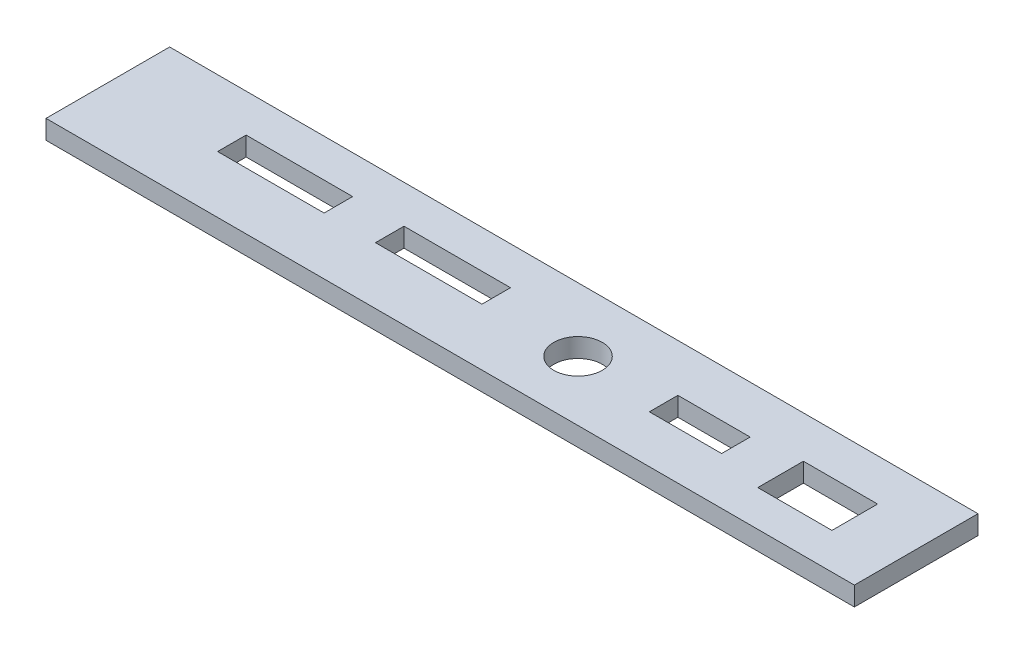
ISO-10303-21;
HEADER;
FILE_DESCRIPTION(('STEP AP214'),'2;1');
FILE_NAME('part.step','',(''),(''),'','','');
FILE_SCHEMA(('AUTOMOTIVE_DESIGN { 1 0 10303 214 1 1 1 1 }'));
ENDSEC;
DATA;
#1=APPLICATION_CONTEXT('core data for automotive mechanical design processes');
#2=APPLICATION_PROTOCOL_DEFINITION('international standard','automotive_design',2000,#1);
#3=PRODUCT_CONTEXT('',#1,'mechanical');
#4=PRODUCT('Part','Part','',(#3));
#5=PRODUCT_RELATED_PRODUCT_CATEGORY('part','',(#4));
#6=PRODUCT_DEFINITION_FORMATION('','',#4);
#7=PRODUCT_DEFINITION_CONTEXT('part definition',#1,'design');
#8=PRODUCT_DEFINITION('design','',#6,#7);
#9=PRODUCT_DEFINITION_SHAPE('','',#8);
#10=(LENGTH_UNIT() NAMED_UNIT(*) SI_UNIT(.MILLI.,.METRE.));
#11=(NAMED_UNIT(*) PLANE_ANGLE_UNIT() SI_UNIT($,.RADIAN.));
#12=(NAMED_UNIT(*) SI_UNIT($,.STERADIAN.) SOLID_ANGLE_UNIT());
#13=UNCERTAINTY_MEASURE_WITH_UNIT(LENGTH_MEASURE(1.E-05),#10,'distance_accuracy_value','');
#14=(GEOMETRIC_REPRESENTATION_CONTEXT(3) GLOBAL_UNCERTAINTY_ASSIGNED_CONTEXT((#13)) GLOBAL_UNIT_ASSIGNED_CONTEXT((#10,
#11,#12)) REPRESENTATION_CONTEXT('',''));
#15=CARTESIAN_POINT('',(0.,0.,0.));
#16=DIRECTION('',(0.,0.,1.));
#17=DIRECTION('',(1.,0.,0.));
#18=AXIS2_PLACEMENT_3D('',#15,#16,#17);
#19=CARTESIAN_POINT('',(0.,2.,0.));
#20=DIRECTION('',(0.,1.,0.));
#21=DIRECTION('',(0.,0.,1.));
#22=AXIS2_PLACEMENT_3D('',#19,#20,#21);
#23=PLANE('',#22);
#24=DIRECTION('',(-1.,0.,0.));
#25=VECTOR('',#24,1.);
#26=CARTESIAN_POINT('',(29.7913481709879,2.,-0.831151968342935));
#27=LINE('',#26,#25);
#28=CARTESIAN_POINT('',(29.7913481709879,2.,-0.831151968342935));
#29=VERTEX_POINT('',#28);
#30=CARTESIAN_POINT('',(18.5913481709879,2.,-0.831151968342933));
#31=VERTEX_POINT('',#30);
#32=EDGE_CURVE('E216',#29,#31,#27,.T.);
#33=ORIENTED_EDGE('',*,*,#32,.F.);
#34=DIRECTION('',(0.,0.,-1.));
#35=VECTOR('',#34,1.);
#36=CARTESIAN_POINT('',(29.7913481709879,2.,2.16884803165706));
#37=LINE('',#36,#35);
#38=CARTESIAN_POINT('',(29.7913481709879,2.,2.16884803165706));
#39=VERTEX_POINT('',#38);
#40=EDGE_CURVE('E214',#39,#29,#37,.T.);
#41=ORIENTED_EDGE('',*,*,#40,.F.);
#42=DIRECTION('',(1.,0.,0.));
#43=VECTOR('',#42,1.);
#44=CARTESIAN_POINT('',(29.7913481709879,2.,2.16884803165706));
#45=LINE('',#44,#43);
#46=CARTESIAN_POINT('',(18.5913481709879,2.,2.16884803165707));
#47=VERTEX_POINT('',#46);
#48=EDGE_CURVE('E222',#47,#39,#45,.T.);
#49=ORIENTED_EDGE('',*,*,#48,.F.);
#50=DIRECTION('',(0.,0.,1.));
#51=VECTOR('',#50,1.);
#52=CARTESIAN_POINT('',(18.5913481709879,2.,2.16884803165707));
#53=LINE('',#52,#51);
#54=EDGE_CURVE('E219',#31,#47,#53,.T.);
#55=ORIENTED_EDGE('',*,*,#54,.F.);
#56=EDGE_LOOP('',(#33,#41,#49,#55));
#57=FACE_BOUND('',#56,.T.);
#58=DIRECTION('',(-1.,0.,0.));
#59=VECTOR('',#58,1.);
#60=CARTESIAN_POINT('',(55.9913481709879,2.,0.168848031657063));
#61=LINE('',#60,#59);
#62=CARTESIAN_POINT('',(55.9913481709879,2.,0.168848031657063));
#63=VERTEX_POINT('',#62);
#64=CARTESIAN_POINT('',(48.3913481709879,2.,0.168848031657064));
#65=VERTEX_POINT('',#64);
#66=EDGE_CURVE('E247',#63,#65,#61,.T.);
#67=ORIENTED_EDGE('',*,*,#66,.F.);
#68=DIRECTION('',(0.,0.,-1.));
#69=VECTOR('',#68,1.);
#70=CARTESIAN_POINT('',(55.9913481709879,2.,3.16884803165706));
#71=LINE('',#70,#69);
#72=CARTESIAN_POINT('',(55.9913481709879,2.,3.16884803165706));
#73=VERTEX_POINT('',#72);
#74=EDGE_CURVE('E245',#73,#63,#71,.T.);
#75=ORIENTED_EDGE('',*,*,#74,.F.);
#76=DIRECTION('',(1.,0.,0.));
#77=VECTOR('',#76,1.);
#78=CARTESIAN_POINT('',(55.9913481709879,2.,3.16884803165706));
#79=LINE('',#78,#77);
#80=CARTESIAN_POINT('',(48.3913481709879,2.,3.16884803165706));
#81=VERTEX_POINT('',#80);
#82=EDGE_CURVE('E253',#81,#73,#79,.T.);
#83=ORIENTED_EDGE('',*,*,#82,.F.);
#84=DIRECTION('',(0.,0.,1.));
#85=VECTOR('',#84,1.);
#86=CARTESIAN_POINT('',(48.3913481709879,2.,3.16884803165706));
#87=LINE('',#86,#85);
#88=EDGE_CURVE('E250',#65,#81,#87,.T.);
#89=ORIENTED_EDGE('',*,*,#88,.F.);
#90=EDGE_LOOP('',(#67,#75,#83,#89));
#91=FACE_BOUND('',#90,.T.);
#92=DIRECTION('',(-1.,0.,0.));
#93=VECTOR('',#92,1.);
#94=CARTESIAN_POINT('',(68.7913481709879,2.,-0.431151968342938));
#95=LINE('',#94,#93);
#96=CARTESIAN_POINT('',(68.7913481709879,2.,-0.431151968342938));
#97=VERTEX_POINT('',#96);
#98=CARTESIAN_POINT('',(60.9913481709879,2.,-0.431151968342937));
#99=VERTEX_POINT('',#98);
#100=EDGE_CURVE('E278',#97,#99,#95,.T.);
#101=ORIENTED_EDGE('',*,*,#100,.F.);
#102=DIRECTION('',(0.,0.,-1.));
#103=VECTOR('',#102,1.);
#104=CARTESIAN_POINT('',(68.7913481709879,2.,4.36884803165706));
#105=LINE('',#104,#103);
#106=CARTESIAN_POINT('',(68.7913481709879,2.,4.36884803165706));
#107=VERTEX_POINT('',#106);
#108=EDGE_CURVE('E276',#107,#97,#105,.T.);
#109=ORIENTED_EDGE('',*,*,#108,.F.);
#110=DIRECTION('',(1.,0.,0.));
#111=VECTOR('',#110,1.);
#112=CARTESIAN_POINT('',(68.7913481709879,2.,4.36884803165706));
#113=LINE('',#112,#111);
#114=CARTESIAN_POINT('',(60.9913481709879,2.,4.36884803165706));
#115=VERTEX_POINT('',#114);
#116=EDGE_CURVE('E284',#115,#107,#113,.T.);
#117=ORIENTED_EDGE('',*,*,#116,.F.);
#118=DIRECTION('',(0.,0.,1.));
#119=VECTOR('',#118,1.);
#120=CARTESIAN_POINT('',(60.9913481709879,2.,4.36884803165706));
#121=LINE('',#120,#119);
#122=EDGE_CURVE('E281',#99,#115,#121,.T.);
#123=ORIENTED_EDGE('',*,*,#122,.F.);
#124=EDGE_LOOP('',(#101,#109,#117,#123));
#125=FACE_BOUND('',#124,.T.);
#126=DIRECTION('',(0.,0.,1.));
#127=VECTOR('',#126,1.);
#128=CARTESIAN_POINT('',(-10.0513698630137,2.,-4.83115196834293));
#129=LINE('',#128,#127);
#130=CARTESIAN_POINT('',(-10.0513698630137,2.,-4.83115196834293));
#131=VERTEX_POINT('',#130);
#132=CARTESIAN_POINT('',(-10.0513698630137,2.,8.16884803165707));
#133=VERTEX_POINT('',#132);
#134=EDGE_CURVE('E307',#131,#133,#129,.T.);
#135=ORIENTED_EDGE('',*,*,#134,.T.);
#136=DIRECTION('',(1.,0.,0.));
#137=VECTOR('',#136,1.);
#138=CARTESIAN_POINT('',(-10.0513698630137,2.,8.16884803165707));
#139=LINE('',#138,#137);
#140=CARTESIAN_POINT('',(74.9486301369863,2.,8.16884803165706));
#141=VERTEX_POINT('',#140);
#142=EDGE_CURVE('E310',#133,#141,#139,.T.);
#143=ORIENTED_EDGE('',*,*,#142,.T.);
#144=DIRECTION('',(0.,0.,-1.));
#145=VECTOR('',#144,1.);
#146=CARTESIAN_POINT('',(74.9486301369863,2.,-4.83115196834293));
#147=LINE('',#146,#145);
#148=CARTESIAN_POINT('',(74.9486301369863,2.,-4.83115196834293));
#149=VERTEX_POINT('',#148);
#150=EDGE_CURVE('E313',#141,#149,#147,.T.);
#151=ORIENTED_EDGE('',*,*,#150,.T.);
#152=DIRECTION('',(-1.,0.,0.));
#153=VECTOR('',#152,1.);
#154=CARTESIAN_POINT('',(-10.0513698630137,2.,-4.83115196834293));
#155=LINE('',#154,#153);
#156=EDGE_CURVE('E315',#149,#131,#155,.T.);
#157=ORIENTED_EDGE('',*,*,#156,.T.);
#158=EDGE_LOOP('',(#135,#143,#151,#157));
#159=FACE_BOUND('',#158,.T.);
#160=CARTESIAN_POINT('',(39.5913481709879,2.,1.86884803165706));
#161=DIRECTION('',(0.,1.,0.));
#162=DIRECTION('',(0.,0.,1.));
#163=AXIS2_PLACEMENT_3D('',#160,#161,#162);
#164=CIRCLE('',#163,2.55);
#165=CARTESIAN_POINT('',(39.5913481709879,2.,4.41884803165706));
#166=VERTEX_POINT('',#165);
#167=EDGE_CURVE('E208',#166,#166,#164,.T.);
#168=ORIENTED_EDGE('',*,*,#167,.F.);
#169=EDGE_LOOP('',(#168));
#170=FACE_BOUND('',#169,.T.);
#171=DIRECTION('',(1.,0.,0.));
#172=VECTOR('',#171,1.);
#173=CARTESIAN_POINT('',(1.99134817098792,2.,2.16884803165707));
#174=LINE('',#173,#172);
#175=CARTESIAN_POINT('',(1.99134817098792,2.,2.16884803165707));
#176=VERTEX_POINT('',#175);
#177=CARTESIAN_POINT('',(13.1913481709879,2.,2.16884803165707));
#178=VERTEX_POINT('',#177);
#179=EDGE_CURVE('E180',#176,#178,#174,.T.);
#180=ORIENTED_EDGE('',*,*,#179,.F.);
#181=DIRECTION('',(0.,0.,1.));
#182=VECTOR('',#181,1.);
#183=CARTESIAN_POINT('',(1.99134817098792,2.,-0.831151968342934));
#184=LINE('',#183,#182);
#185=CARTESIAN_POINT('',(1.99134817098792,2.,-0.831151968342934));
#186=VERTEX_POINT('',#185);
#187=EDGE_CURVE('E172',#186,#176,#184,.T.);
#188=ORIENTED_EDGE('',*,*,#187,.F.);
#189=DIRECTION('',(-1.,0.,0.));
#190=VECTOR('',#189,1.);
#191=CARTESIAN_POINT('',(1.99134817098792,2.,-0.831151968342934));
#192=LINE('',#191,#190);
#193=CARTESIAN_POINT('',(13.1913481709879,2.,-0.831151968342934));
#194=VERTEX_POINT('',#193);
#195=EDGE_CURVE('E194',#194,#186,#192,.T.);
#196=ORIENTED_EDGE('',*,*,#195,.F.);
#197=DIRECTION('',(0.,0.,-1.));
#198=VECTOR('',#197,1.);
#199=CARTESIAN_POINT('',(13.1913481709879,2.,-0.831151968342934));
#200=LINE('',#199,#198);
#201=EDGE_CURVE('E192',#178,#194,#200,.T.);
#202=ORIENTED_EDGE('',*,*,#201,.F.);
#203=EDGE_LOOP('',(#180,#188,#196,#202));
#204=FACE_BOUND('',#203,.T.);
#205=ADVANCED_FACE('F35',(#57,#91,#125,#159,#170,#204),#23,.T.);
#206=CARTESIAN_POINT('',(0.,0.,0.));
#207=DIRECTION('',(0.,1.,0.));
#208=DIRECTION('',(0.,0.,1.));
#209=AXIS2_PLACEMENT_3D('',#206,#207,#208);
#210=PLANE('',#209);
#211=CARTESIAN_POINT('',(39.5913481709879,0.,1.86884803165706));
#212=DIRECTION('',(0.,1.,0.));
#213=DIRECTION('',(0.,0.,1.));
#214=AXIS2_PLACEMENT_3D('',#211,#212,#213);
#215=CIRCLE('',#214,2.55);
#216=CARTESIAN_POINT('',(39.5913481709879,0.,4.41884803165706));
#217=VERTEX_POINT('',#216);
#218=EDGE_CURVE('E188',#217,#217,#215,.T.);
#219=ORIENTED_EDGE('',*,*,#218,.T.);
#220=EDGE_LOOP('',(#219));
#221=FACE_BOUND('',#220,.T.);
#222=DIRECTION('',(0.,0.,-1.));
#223=VECTOR('',#222,1.);
#224=CARTESIAN_POINT('',(29.7913481709879,0.,2.16884803165706));
#225=LINE('',#224,#223);
#226=CARTESIAN_POINT('',(29.7913481709879,0.,2.16884803165706));
#227=VERTEX_POINT('',#226);
#228=CARTESIAN_POINT('',(29.7913481709879,0.,-0.831151968342935));
#229=VERTEX_POINT('',#228);
#230=EDGE_CURVE('E211',#227,#229,#225,.T.);
#231=ORIENTED_EDGE('',*,*,#230,.T.);
#232=DIRECTION('',(-1.,0.,0.));
#233=VECTOR('',#232,1.);
#234=CARTESIAN_POINT('',(29.7913481709879,0.,-0.831151968342935));
#235=LINE('',#234,#233);
#236=CARTESIAN_POINT('',(18.5913481709879,0.,-0.831151968342933));
#237=VERTEX_POINT('',#236);
#238=EDGE_CURVE('E227',#229,#237,#235,.T.);
#239=ORIENTED_EDGE('',*,*,#238,.T.);
#240=DIRECTION('',(0.,0.,1.));
#241=VECTOR('',#240,1.);
#242=CARTESIAN_POINT('',(18.5913481709879,0.,2.16884803165707));
#243=LINE('',#242,#241);
#244=CARTESIAN_POINT('',(18.5913481709879,0.,2.16884803165707));
#245=VERTEX_POINT('',#244);
#246=EDGE_CURVE('E230',#237,#245,#243,.T.);
#247=ORIENTED_EDGE('',*,*,#246,.T.);
#248=DIRECTION('',(1.,0.,0.));
#249=VECTOR('',#248,1.);
#250=CARTESIAN_POINT('',(29.7913481709879,0.,2.16884803165706));
#251=LINE('',#250,#249);
#252=EDGE_CURVE('E217',#245,#227,#251,.T.);
#253=ORIENTED_EDGE('',*,*,#252,.T.);
#254=EDGE_LOOP('',(#231,#239,#247,#253));
#255=FACE_BOUND('',#254,.T.);
#256=DIRECTION('',(0.,0.,-1.));
#257=VECTOR('',#256,1.);
#258=CARTESIAN_POINT('',(68.7913481709879,0.,4.36884803165706));
#259=LINE('',#258,#257);
#260=CARTESIAN_POINT('',(68.7913481709879,0.,4.36884803165706));
#261=VERTEX_POINT('',#260);
#262=CARTESIAN_POINT('',(68.7913481709879,0.,-0.431151968342938));
#263=VERTEX_POINT('',#262);
#264=EDGE_CURVE('E275',#261,#263,#259,.T.);
#265=ORIENTED_EDGE('',*,*,#264,.T.);
#266=DIRECTION('',(-1.,0.,0.));
#267=VECTOR('',#266,1.);
#268=CARTESIAN_POINT('',(68.7913481709879,0.,-0.431151968342938));
#269=LINE('',#268,#267);
#270=CARTESIAN_POINT('',(60.9913481709879,0.,-0.431151968342937));
#271=VERTEX_POINT('',#270);
#272=EDGE_CURVE('E289',#263,#271,#269,.T.);
#273=ORIENTED_EDGE('',*,*,#272,.T.);
#274=DIRECTION('',(0.,0.,1.));
#275=VECTOR('',#274,1.);
#276=CARTESIAN_POINT('',(60.9913481709879,0.,4.36884803165706));
#277=LINE('',#276,#275);
#278=CARTESIAN_POINT('',(60.9913481709879,0.,4.36884803165706));
#279=VERTEX_POINT('',#278);
#280=EDGE_CURVE('E292',#271,#279,#277,.T.);
#281=ORIENTED_EDGE('',*,*,#280,.T.);
#282=DIRECTION('',(1.,0.,0.));
#283=VECTOR('',#282,1.);
#284=CARTESIAN_POINT('',(68.7913481709879,0.,4.36884803165706));
#285=LINE('',#284,#283);
#286=EDGE_CURVE('E279',#279,#261,#285,.T.);
#287=ORIENTED_EDGE('',*,*,#286,.T.);
#288=EDGE_LOOP('',(#265,#273,#281,#287));
#289=FACE_BOUND('',#288,.T.);
#290=DIRECTION('',(0.,0.,1.));
#291=VECTOR('',#290,1.);
#292=CARTESIAN_POINT('',(-10.0513698630137,0.,-4.83115196834293));
#293=LINE('',#292,#291);
#294=CARTESIAN_POINT('',(-10.0513698630137,0.,-4.83115196834293));
#295=VERTEX_POINT('',#294);
#296=CARTESIAN_POINT('',(-10.0513698630137,0.,8.16884803165707));
#297=VERTEX_POINT('',#296);
#298=EDGE_CURVE('E306',#295,#297,#293,.T.);
#299=ORIENTED_EDGE('',*,*,#298,.F.);
#300=DIRECTION('',(-1.,0.,0.));
#301=VECTOR('',#300,1.);
#302=CARTESIAN_POINT('',(-10.0513698630137,0.,-4.83115196834293));
#303=LINE('',#302,#301);
#304=CARTESIAN_POINT('',(74.9486301369863,0.,-4.83115196834293));
#305=VERTEX_POINT('',#304);
#306=EDGE_CURVE('E311',#305,#295,#303,.T.);
#307=ORIENTED_EDGE('',*,*,#306,.F.);
#308=DIRECTION('',(0.,0.,-1.));
#309=VECTOR('',#308,1.);
#310=CARTESIAN_POINT('',(74.9486301369863,0.,-4.83115196834293));
#311=LINE('',#310,#309);
#312=CARTESIAN_POINT('',(74.9486301369863,0.,8.16884803165706));
#313=VERTEX_POINT('',#312);
#314=EDGE_CURVE('E322',#313,#305,#311,.T.);
#315=ORIENTED_EDGE('',*,*,#314,.F.);
#316=DIRECTION('',(1.,0.,0.));
#317=VECTOR('',#316,1.);
#318=CARTESIAN_POINT('',(-10.0513698630137,0.,8.16884803165707));
#319=LINE('',#318,#317);
#320=EDGE_CURVE('E320',#297,#313,#319,.T.);
#321=ORIENTED_EDGE('',*,*,#320,.F.);
#322=EDGE_LOOP('',(#299,#307,#315,#321));
#323=FACE_BOUND('',#322,.T.);
#324=DIRECTION('',(0.,0.,-1.));
#325=VECTOR('',#324,1.);
#326=CARTESIAN_POINT('',(55.9913481709879,0.,3.16884803165706));
#327=LINE('',#326,#325);
#328=CARTESIAN_POINT('',(55.9913481709879,0.,3.16884803165706));
#329=VERTEX_POINT('',#328);
#330=CARTESIAN_POINT('',(55.9913481709879,0.,0.168848031657063));
#331=VERTEX_POINT('',#330);
#332=EDGE_CURVE('E244',#329,#331,#327,.T.);
#333=ORIENTED_EDGE('',*,*,#332,.T.);
#334=DIRECTION('',(-1.,0.,0.));
#335=VECTOR('',#334,1.);
#336=CARTESIAN_POINT('',(55.9913481709879,0.,0.168848031657063));
#337=LINE('',#336,#335);
#338=CARTESIAN_POINT('',(48.3913481709879,0.,0.168848031657064));
#339=VERTEX_POINT('',#338);
#340=EDGE_CURVE('E258',#331,#339,#337,.T.);
#341=ORIENTED_EDGE('',*,*,#340,.T.);
#342=DIRECTION('',(0.,0.,1.));
#343=VECTOR('',#342,1.);
#344=CARTESIAN_POINT('',(48.3913481709879,0.,3.16884803165706));
#345=LINE('',#344,#343);
#346=CARTESIAN_POINT('',(48.3913481709879,0.,3.16884803165706));
#347=VERTEX_POINT('',#346);
#348=EDGE_CURVE('E261',#339,#347,#345,.T.);
#349=ORIENTED_EDGE('',*,*,#348,.T.);
#350=DIRECTION('',(1.,0.,0.));
#351=VECTOR('',#350,1.);
#352=CARTESIAN_POINT('',(55.9913481709879,0.,3.16884803165706));
#353=LINE('',#352,#351);
#354=EDGE_CURVE('E248',#347,#329,#353,.T.);
#355=ORIENTED_EDGE('',*,*,#354,.T.);
#356=EDGE_LOOP('',(#333,#341,#349,#355));
#357=FACE_BOUND('',#356,.T.);
#358=DIRECTION('',(0.,0.,1.));
#359=VECTOR('',#358,1.);
#360=CARTESIAN_POINT('',(1.99134817098792,0.,-0.831151968342934));
#361=LINE('',#360,#359);
#362=CARTESIAN_POINT('',(1.99134817098792,0.,-0.831151968342934));
#363=VERTEX_POINT('',#362);
#364=CARTESIAN_POINT('',(1.99134817098792,0.,2.16884803165707));
#365=VERTEX_POINT('',#364);
#366=EDGE_CURVE('E58',#363,#365,#361,.T.);
#367=ORIENTED_EDGE('',*,*,#366,.T.);
#368=DIRECTION('',(1.,0.,0.));
#369=VECTOR('',#368,1.);
#370=CARTESIAN_POINT('',(1.99134817098792,0.,2.16884803165707));
#371=LINE('',#370,#369);
#372=CARTESIAN_POINT('',(13.1913481709879,0.,2.16884803165707));
#373=VERTEX_POINT('',#372);
#374=EDGE_CURVE('E187',#365,#373,#371,.T.);
#375=ORIENTED_EDGE('',*,*,#374,.T.);
#376=DIRECTION('',(0.,0.,-1.));
#377=VECTOR('',#376,1.);
#378=CARTESIAN_POINT('',(13.1913481709879,0.,-0.831151968342934));
#379=LINE('',#378,#377);
#380=CARTESIAN_POINT('',(13.1913481709879,0.,-0.831151968342934));
#381=VERTEX_POINT('',#380);
#382=EDGE_CURVE('E200',#373,#381,#379,.T.);
#383=ORIENTED_EDGE('',*,*,#382,.T.);
#384=DIRECTION('',(-1.,0.,0.));
#385=VECTOR('',#384,1.);
#386=CARTESIAN_POINT('',(1.99134817098792,0.,-0.831151968342934));
#387=LINE('',#386,#385);
#388=EDGE_CURVE('E181',#381,#363,#387,.T.);
#389=ORIENTED_EDGE('',*,*,#388,.T.);
#390=EDGE_LOOP('',(#367,#375,#383,#389));
#391=FACE_BOUND('',#390,.T.);
#392=ADVANCED_FACE('F340',(#221,#255,#289,#323,#357,#391),#210,.F.);
#393=CARTESIAN_POINT('',(-10.0513698630137,2.,-4.83115196834293));
#394=DIRECTION('',(1.,0.,0.));
#395=DIRECTION('',(0.,0.,-1.));
#396=AXIS2_PLACEMENT_3D('',#393,#394,#395);
#397=PLANE('',#396);
#398=ORIENTED_EDGE('',*,*,#298,.T.);
#399=DIRECTION('',(0.,-1.,0.));
#400=VECTOR('',#399,1.);
#401=CARTESIAN_POINT('',(-10.0513698630137,2.,8.16884803165707));
#402=LINE('',#401,#400);
#403=EDGE_CURVE('E11',#133,#297,#402,.T.);
#404=ORIENTED_EDGE('',*,*,#403,.F.);
#405=ORIENTED_EDGE('',*,*,#134,.F.);
#406=DIRECTION('',(0.,-1.,0.));
#407=VECTOR('',#406,1.);
#408=CARTESIAN_POINT('',(-10.0513698630137,2.,-4.83115196834293));
#409=LINE('',#408,#407);
#410=EDGE_CURVE('E317',#131,#295,#409,.T.);
#411=ORIENTED_EDGE('',*,*,#410,.T.);
#412=EDGE_LOOP('',(#398,#404,#405,#411));
#413=FACE_BOUND('',#412,.T.);
#414=ADVANCED_FACE('F37',(#413),#397,.F.);
#415=CARTESIAN_POINT('',(-10.0513698630137,2.,8.16884803165707));
#416=DIRECTION('',(0.,0.,-1.));
#417=DIRECTION('',(-1.,0.,0.));
#418=AXIS2_PLACEMENT_3D('',#415,#416,#417);
#419=PLANE('',#418);
#420=ORIENTED_EDGE('',*,*,#320,.T.);
#421=DIRECTION('',(0.,-1.,0.));
#422=VECTOR('',#421,1.);
#423=CARTESIAN_POINT('',(74.9486301369863,2.,8.16884803165706));
#424=LINE('',#423,#422);
#425=EDGE_CURVE('E43',#141,#313,#424,.T.);
#426=ORIENTED_EDGE('',*,*,#425,.F.);
#427=ORIENTED_EDGE('',*,*,#142,.F.);
#428=ORIENTED_EDGE('',*,*,#403,.T.);
#429=EDGE_LOOP('',(#420,#426,#427,#428));
#430=FACE_BOUND('',#429,.T.);
#431=ADVANCED_FACE('F351',(#430),#419,.F.);
#432=CARTESIAN_POINT('',(74.9486301369863,2.,-4.83115196834293));
#433=DIRECTION('',(-1.,0.,0.));
#434=DIRECTION('',(0.,0.,1.));
#435=AXIS2_PLACEMENT_3D('',#432,#433,#434);
#436=PLANE('',#435);
#437=ORIENTED_EDGE('',*,*,#314,.T.);
#438=DIRECTION('',(0.,-1.,0.));
#439=VECTOR('',#438,1.);
#440=CARTESIAN_POINT('',(74.9486301369863,2.,-4.83115196834293));
#441=LINE('',#440,#439);
#442=EDGE_CURVE('E327',#149,#305,#441,.T.);
#443=ORIENTED_EDGE('',*,*,#442,.F.);
#444=ORIENTED_EDGE('',*,*,#150,.F.);
#445=ORIENTED_EDGE('',*,*,#425,.T.);
#446=EDGE_LOOP('',(#437,#443,#444,#445));
#447=FACE_BOUND('',#446,.T.);
#448=ADVANCED_FACE('F334',(#447),#436,.F.);
#449=CARTESIAN_POINT('',(-10.0513698630137,2.,-4.83115196834293));
#450=DIRECTION('',(0.,0.,1.));
#451=DIRECTION('',(1.,0.,0.));
#452=AXIS2_PLACEMENT_3D('',#449,#450,#451);
#453=PLANE('',#452);
#454=ORIENTED_EDGE('',*,*,#306,.T.);
#455=ORIENTED_EDGE('',*,*,#410,.F.);
#456=ORIENTED_EDGE('',*,*,#156,.F.);
#457=ORIENTED_EDGE('',*,*,#442,.T.);
#458=EDGE_LOOP('',(#454,#455,#456,#457));
#459=FACE_BOUND('',#458,.T.);
#460=ADVANCED_FACE('F344',(#459),#453,.F.);
#461=CARTESIAN_POINT('',(68.7913481709879,2.,4.36884803165706));
#462=DIRECTION('',(-1.,0.,0.));
#463=DIRECTION('',(0.,0.,1.));
#464=AXIS2_PLACEMENT_3D('',#461,#462,#463);
#465=PLANE('',#464);
#466=ORIENTED_EDGE('',*,*,#264,.F.);
#467=DIRECTION('',(0.,-1.,0.));
#468=VECTOR('',#467,1.);
#469=CARTESIAN_POINT('',(68.7913481709879,2.,4.36884803165706));
#470=LINE('',#469,#468);
#471=EDGE_CURVE('E286',#107,#261,#470,.T.);
#472=ORIENTED_EDGE('',*,*,#471,.F.);
#473=ORIENTED_EDGE('',*,*,#108,.T.);
#474=DIRECTION('',(0.,-1.,0.));
#475=VECTOR('',#474,1.);
#476=CARTESIAN_POINT('',(68.7913481709879,2.,-0.431151968342938));
#477=LINE('',#476,#475);
#478=EDGE_CURVE('E303',#97,#263,#477,.T.);
#479=ORIENTED_EDGE('',*,*,#478,.T.);
#480=EDGE_LOOP('',(#466,#472,#473,#479));
#481=FACE_BOUND('',#480,.T.);
#482=ADVANCED_FACE('F369',(#481),#465,.T.);
#483=CARTESIAN_POINT('',(68.7913481709879,2.,-0.431151968342938));
#484=DIRECTION('',(0.,0.,1.));
#485=DIRECTION('',(1.,0.,0.));
#486=AXIS2_PLACEMENT_3D('',#483,#484,#485);
#487=PLANE('',#486);
#488=ORIENTED_EDGE('',*,*,#272,.F.);
#489=ORIENTED_EDGE('',*,*,#478,.F.);
#490=ORIENTED_EDGE('',*,*,#100,.T.);
#491=DIRECTION('',(0.,-1.,0.));
#492=VECTOR('',#491,1.);
#493=CARTESIAN_POINT('',(60.9913481709879,2.,-0.431151968342937));
#494=LINE('',#493,#492);
#495=EDGE_CURVE('E301',#99,#271,#494,.T.);
#496=ORIENTED_EDGE('',*,*,#495,.T.);
#497=EDGE_LOOP('',(#488,#489,#490,#496));
#498=FACE_BOUND('',#497,.T.);
#499=ADVANCED_FACE('F376',(#498),#487,.T.);
#500=CARTESIAN_POINT('',(60.9913481709879,2.,4.36884803165706));
#501=DIRECTION('',(1.,0.,0.));
#502=DIRECTION('',(0.,0.,-1.));
#503=AXIS2_PLACEMENT_3D('',#500,#501,#502);
#504=PLANE('',#503);
#505=ORIENTED_EDGE('',*,*,#280,.F.);
#506=ORIENTED_EDGE('',*,*,#495,.F.);
#507=ORIENTED_EDGE('',*,*,#122,.T.);
#508=DIRECTION('',(0.,-1.,0.));
#509=VECTOR('',#508,1.);
#510=CARTESIAN_POINT('',(60.9913481709879,2.,4.36884803165706));
#511=LINE('',#510,#509);
#512=EDGE_CURVE('E299',#115,#279,#511,.T.);
#513=ORIENTED_EDGE('',*,*,#512,.T.);
#514=EDGE_LOOP('',(#505,#506,#507,#513));
#515=FACE_BOUND('',#514,.T.);
#516=ADVANCED_FACE('F381',(#515),#504,.T.);
#517=CARTESIAN_POINT('',(68.7913481709879,2.,4.36884803165706));
#518=DIRECTION('',(0.,0.,-1.));
#519=DIRECTION('',(-1.,0.,0.));
#520=AXIS2_PLACEMENT_3D('',#517,#518,#519);
#521=PLANE('',#520);
#522=ORIENTED_EDGE('',*,*,#286,.F.);
#523=ORIENTED_EDGE('',*,*,#512,.F.);
#524=ORIENTED_EDGE('',*,*,#116,.T.);
#525=ORIENTED_EDGE('',*,*,#471,.T.);
#526=EDGE_LOOP('',(#522,#523,#524,#525));
#527=FACE_BOUND('',#526,.T.);
#528=ADVANCED_FACE('F389',(#527),#521,.T.);
#529=CARTESIAN_POINT('',(55.9913481709879,2.,3.16884803165706));
#530=DIRECTION('',(-1.,0.,0.));
#531=DIRECTION('',(0.,0.,1.));
#532=AXIS2_PLACEMENT_3D('',#529,#530,#531);
#533=PLANE('',#532);
#534=ORIENTED_EDGE('',*,*,#332,.F.);
#535=DIRECTION('',(0.,-1.,0.));
#536=VECTOR('',#535,1.);
#537=CARTESIAN_POINT('',(55.9913481709879,2.,3.16884803165706));
#538=LINE('',#537,#536);
#539=EDGE_CURVE('E255',#73,#329,#538,.T.);
#540=ORIENTED_EDGE('',*,*,#539,.F.);
#541=ORIENTED_EDGE('',*,*,#74,.T.);
#542=DIRECTION('',(0.,-1.,0.));
#543=VECTOR('',#542,1.);
#544=CARTESIAN_POINT('',(55.9913481709879,2.,0.168848031657063));
#545=LINE('',#544,#543);
#546=EDGE_CURVE('E272',#63,#331,#545,.T.);
#547=ORIENTED_EDGE('',*,*,#546,.T.);
#548=EDGE_LOOP('',(#534,#540,#541,#547));
#549=FACE_BOUND('',#548,.T.);
#550=ADVANCED_FACE('F402',(#549),#533,.T.);
#551=CARTESIAN_POINT('',(55.9913481709879,2.,0.168848031657063));
#552=DIRECTION('',(0.,0.,1.));
#553=DIRECTION('',(1.,0.,0.));
#554=AXIS2_PLACEMENT_3D('',#551,#552,#553);
#555=PLANE('',#554);
#556=ORIENTED_EDGE('',*,*,#340,.F.);
#557=ORIENTED_EDGE('',*,*,#546,.F.);
#558=ORIENTED_EDGE('',*,*,#66,.T.);
#559=DIRECTION('',(0.,-1.,0.));
#560=VECTOR('',#559,1.);
#561=CARTESIAN_POINT('',(48.3913481709879,2.,0.168848031657064));
#562=LINE('',#561,#560);
#563=EDGE_CURVE('E270',#65,#339,#562,.T.);
#564=ORIENTED_EDGE('',*,*,#563,.T.);
#565=EDGE_LOOP('',(#556,#557,#558,#564));
#566=FACE_BOUND('',#565,.T.);
#567=ADVANCED_FACE('F407',(#566),#555,.T.);
#568=CARTESIAN_POINT('',(48.3913481709879,2.,3.16884803165706));
#569=DIRECTION('',(1.,0.,0.));
#570=DIRECTION('',(0.,0.,-1.));
#571=AXIS2_PLACEMENT_3D('',#568,#569,#570);
#572=PLANE('',#571);
#573=ORIENTED_EDGE('',*,*,#348,.F.);
#574=ORIENTED_EDGE('',*,*,#563,.F.);
#575=ORIENTED_EDGE('',*,*,#88,.T.);
#576=DIRECTION('',(0.,-1.,0.));
#577=VECTOR('',#576,1.);
#578=CARTESIAN_POINT('',(48.3913481709879,2.,3.16884803165706));
#579=LINE('',#578,#577);
#580=EDGE_CURVE('E268',#81,#347,#579,.T.);
#581=ORIENTED_EDGE('',*,*,#580,.T.);
#582=EDGE_LOOP('',(#573,#574,#575,#581));
#583=FACE_BOUND('',#582,.T.);
#584=ADVANCED_FACE('F411',(#583),#572,.T.);
#585=CARTESIAN_POINT('',(55.9913481709879,2.,3.16884803165706));
#586=DIRECTION('',(0.,0.,-1.));
#587=DIRECTION('',(-1.,0.,0.));
#588=AXIS2_PLACEMENT_3D('',#585,#586,#587);
#589=PLANE('',#588);
#590=ORIENTED_EDGE('',*,*,#354,.F.);
#591=ORIENTED_EDGE('',*,*,#580,.F.);
#592=ORIENTED_EDGE('',*,*,#82,.T.);
#593=ORIENTED_EDGE('',*,*,#539,.T.);
#594=EDGE_LOOP('',(#590,#591,#592,#593));
#595=FACE_BOUND('',#594,.T.);
#596=ADVANCED_FACE('F415',(#595),#589,.T.);
#597=CARTESIAN_POINT('',(29.7913481709879,2.,2.16884803165706));
#598=DIRECTION('',(-1.,0.,0.));
#599=DIRECTION('',(0.,0.,1.));
#600=AXIS2_PLACEMENT_3D('',#597,#598,#599);
#601=PLANE('',#600);
#602=ORIENTED_EDGE('',*,*,#230,.F.);
#603=DIRECTION('',(0.,-1.,0.));
#604=VECTOR('',#603,1.);
#605=CARTESIAN_POINT('',(29.7913481709879,2.,2.16884803165706));
#606=LINE('',#605,#604);
#607=EDGE_CURVE('E224',#39,#227,#606,.T.);
#608=ORIENTED_EDGE('',*,*,#607,.F.);
#609=ORIENTED_EDGE('',*,*,#40,.T.);
#610=DIRECTION('',(0.,-1.,0.));
#611=VECTOR('',#610,1.);
#612=CARTESIAN_POINT('',(29.7913481709879,2.,-0.831151968342935));
#613=LINE('',#612,#611);
#614=EDGE_CURVE('E241',#29,#229,#613,.T.);
#615=ORIENTED_EDGE('',*,*,#614,.T.);
#616=EDGE_LOOP('',(#602,#608,#609,#615));
#617=FACE_BOUND('',#616,.T.);
#618=ADVANCED_FACE('F419',(#617),#601,.T.);
#619=CARTESIAN_POINT('',(29.7913481709879,2.,-0.831151968342935));
#620=DIRECTION('',(0.,0.,1.));
#621=DIRECTION('',(1.,0.,0.));
#622=AXIS2_PLACEMENT_3D('',#619,#620,#621);
#623=PLANE('',#622);
#624=ORIENTED_EDGE('',*,*,#238,.F.);
#625=ORIENTED_EDGE('',*,*,#614,.F.);
#626=ORIENTED_EDGE('',*,*,#32,.T.);
#627=DIRECTION('',(0.,-1.,0.));
#628=VECTOR('',#627,1.);
#629=CARTESIAN_POINT('',(18.5913481709879,2.,-0.831151968342933));
#630=LINE('',#629,#628);
#631=EDGE_CURVE('E239',#31,#237,#630,.T.);
#632=ORIENTED_EDGE('',*,*,#631,.T.);
#633=EDGE_LOOP('',(#624,#625,#626,#632));
#634=FACE_BOUND('',#633,.T.);
#635=ADVANCED_FACE('F423',(#634),#623,.T.);
#636=CARTESIAN_POINT('',(18.5913481709879,2.,2.16884803165707));
#637=DIRECTION('',(1.,0.,0.));
#638=DIRECTION('',(0.,0.,-1.));
#639=AXIS2_PLACEMENT_3D('',#636,#637,#638);
#640=PLANE('',#639);
#641=ORIENTED_EDGE('',*,*,#246,.F.);
#642=ORIENTED_EDGE('',*,*,#631,.F.);
#643=ORIENTED_EDGE('',*,*,#54,.T.);
#644=DIRECTION('',(0.,-1.,0.));
#645=VECTOR('',#644,1.);
#646=CARTESIAN_POINT('',(18.5913481709879,2.,2.16884803165707));
#647=LINE('',#646,#645);
#648=EDGE_CURVE('E237',#47,#245,#647,.T.);
#649=ORIENTED_EDGE('',*,*,#648,.T.);
#650=EDGE_LOOP('',(#641,#642,#643,#649));
#651=FACE_BOUND('',#650,.T.);
#652=ADVANCED_FACE('F427',(#651),#640,.T.);
#653=CARTESIAN_POINT('',(29.7913481709879,2.,2.16884803165706));
#654=DIRECTION('',(0.,0.,-1.));
#655=DIRECTION('',(-1.,0.,0.));
#656=AXIS2_PLACEMENT_3D('',#653,#654,#655);
#657=PLANE('',#656);
#658=ORIENTED_EDGE('',*,*,#252,.F.);
#659=ORIENTED_EDGE('',*,*,#648,.F.);
#660=ORIENTED_EDGE('',*,*,#48,.T.);
#661=ORIENTED_EDGE('',*,*,#607,.T.);
#662=EDGE_LOOP('',(#658,#659,#660,#661));
#663=FACE_BOUND('',#662,.T.);
#664=ADVANCED_FACE('F431',(#663),#657,.T.);
#665=CARTESIAN_POINT('',(39.5913481709879,2.,1.86884803165706));
#666=DIRECTION('',(0.,-1.,0.));
#667=DIRECTION('',(0.,0.,-1.));
#668=AXIS2_PLACEMENT_3D('',#665,#666,#667);
#669=CYLINDRICAL_SURFACE('',#668,2.55);
#670=ORIENTED_EDGE('',*,*,#167,.T.);
#671=EDGE_LOOP('',(#670));
#672=FACE_BOUND('',#671,.T.);
#673=ORIENTED_EDGE('',*,*,#218,.F.);
#674=EDGE_LOOP('',(#673));
#675=FACE_BOUND('',#674,.T.);
#676=ADVANCED_FACE('F435',(#672,#675),#669,.F.);
#677=CARTESIAN_POINT('',(1.99134817098792,2.,-0.831151968342934));
#678=DIRECTION('',(1.,0.,0.));
#679=DIRECTION('',(0.,0.,-1.));
#680=AXIS2_PLACEMENT_3D('',#677,#678,#679);
#681=PLANE('',#680);
#682=ORIENTED_EDGE('',*,*,#366,.F.);
#683=DIRECTION('',(0.,-1.,0.));
#684=VECTOR('',#683,1.);
#685=CARTESIAN_POINT('',(1.99134817098792,2.,-0.831151968342934));
#686=LINE('',#685,#684);
#687=EDGE_CURVE('E176',#186,#363,#686,.T.);
#688=ORIENTED_EDGE('',*,*,#687,.F.);
#689=ORIENTED_EDGE('',*,*,#187,.T.);
#690=DIRECTION('',(0.,-1.,0.));
#691=VECTOR('',#690,1.);
#692=CARTESIAN_POINT('',(1.99134817098792,2.,2.16884803165707));
#693=LINE('',#692,#691);
#694=EDGE_CURVE('E175',#176,#365,#693,.T.);
#695=ORIENTED_EDGE('',*,*,#694,.T.);
#696=EDGE_LOOP('',(#682,#688,#689,#695));
#697=FACE_BOUND('',#696,.T.);
#698=ADVANCED_FACE('F174',(#697),#681,.T.);
#699=CARTESIAN_POINT('',(1.99134817098792,2.,2.16884803165707));
#700=DIRECTION('',(0.,0.,-1.));
#701=DIRECTION('',(-1.,0.,0.));
#702=AXIS2_PLACEMENT_3D('',#699,#700,#701);
#703=PLANE('',#702);
#704=ORIENTED_EDGE('',*,*,#374,.F.);
#705=ORIENTED_EDGE('',*,*,#694,.F.);
#706=ORIENTED_EDGE('',*,*,#179,.T.);
#707=DIRECTION('',(0.,-1.,0.));
#708=VECTOR('',#707,1.);
#709=CARTESIAN_POINT('',(13.1913481709879,2.,2.16884803165707));
#710=LINE('',#709,#708);
#711=EDGE_CURVE('E189',#178,#373,#710,.T.);
#712=ORIENTED_EDGE('',*,*,#711,.T.);
#713=EDGE_LOOP('',(#704,#705,#706,#712));
#714=FACE_BOUND('',#713,.T.);
#715=ADVANCED_FACE('F184',(#714),#703,.T.);
#716=CARTESIAN_POINT('',(13.1913481709879,2.,-0.831151968342934));
#717=DIRECTION('',(-1.,0.,0.));
#718=DIRECTION('',(0.,0.,1.));
#719=AXIS2_PLACEMENT_3D('',#716,#717,#718);
#720=PLANE('',#719);
#721=ORIENTED_EDGE('',*,*,#382,.F.);
#722=ORIENTED_EDGE('',*,*,#711,.F.);
#723=ORIENTED_EDGE('',*,*,#201,.T.);
#724=DIRECTION('',(0.,-1.,0.));
#725=VECTOR('',#724,1.);
#726=CARTESIAN_POINT('',(13.1913481709879,2.,-0.831151968342934));
#727=LINE('',#726,#725);
#728=EDGE_CURVE('E50',#194,#381,#727,.T.);
#729=ORIENTED_EDGE('',*,*,#728,.T.);
#730=EDGE_LOOP('',(#721,#722,#723,#729));
#731=FACE_BOUND('',#730,.T.);
#732=ADVANCED_FACE('F444',(#731),#720,.T.);
#733=CARTESIAN_POINT('',(1.99134817098792,2.,-0.831151968342934));
#734=DIRECTION('',(0.,0.,1.));
#735=DIRECTION('',(1.,0.,0.));
#736=AXIS2_PLACEMENT_3D('',#733,#734,#735);
#737=PLANE('',#736);
#738=ORIENTED_EDGE('',*,*,#388,.F.);
#739=ORIENTED_EDGE('',*,*,#728,.F.);
#740=ORIENTED_EDGE('',*,*,#195,.T.);
#741=ORIENTED_EDGE('',*,*,#687,.T.);
#742=EDGE_LOOP('',(#738,#739,#740,#741));
#743=FACE_BOUND('',#742,.T.);
#744=ADVANCED_FACE('F447',(#743),#737,.T.);
#745=CLOSED_SHELL('',(#205,#392,#414,#431,#448,#460,#482,#499,#516,#528,#550,#567,#584,#596,
#618,#635,#652,#664,#676,#698,#715,#732,#744));
#746=MANIFOLD_SOLID_BREP('B2',#745);
#747=ADVANCED_BREP_SHAPE_REPRESENTATION('',(#18,#746),#14);
#748=SHAPE_DEFINITION_REPRESENTATION(#9,#747);
ENDSEC;
END-ISO-10303-21;
